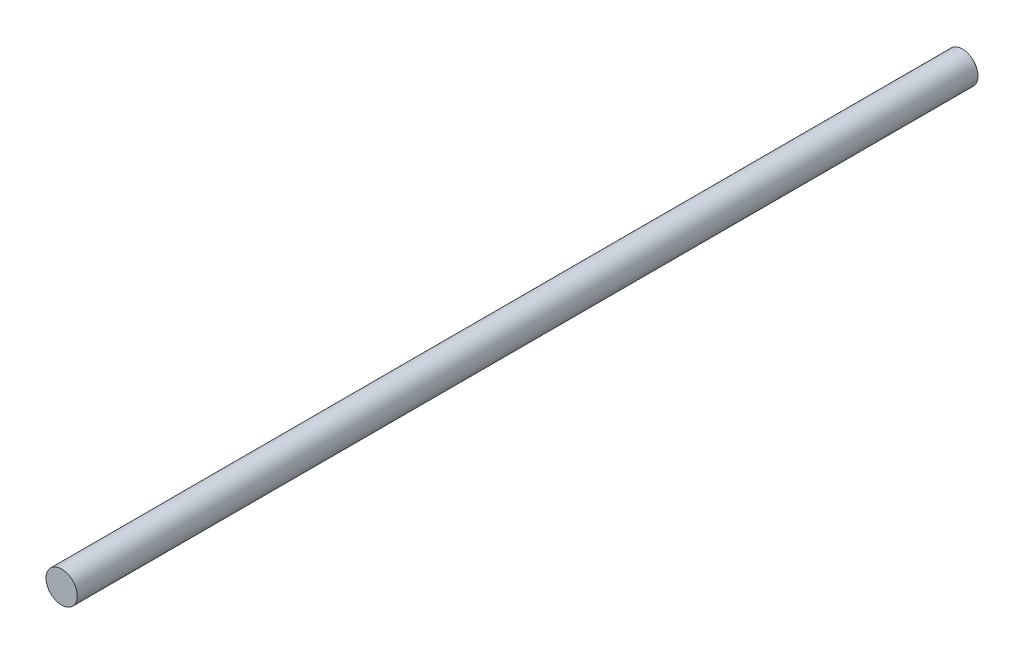
ISO-10303-21;
HEADER;
FILE_DESCRIPTION(('STEP AP214'),'2;1');
FILE_NAME('part.step','',(''),(''),'','','');
FILE_SCHEMA(('AUTOMOTIVE_DESIGN { 1 0 10303 214 1 1 1 1 }'));
ENDSEC;
DATA;
#1=APPLICATION_CONTEXT('core data for automotive mechanical design processes');
#2=APPLICATION_PROTOCOL_DEFINITION('international standard','automotive_design',2000,#1);
#3=PRODUCT_CONTEXT('',#1,'mechanical');
#4=PRODUCT('Part','Part','',(#3));
#5=PRODUCT_RELATED_PRODUCT_CATEGORY('part','',(#4));
#6=PRODUCT_DEFINITION_FORMATION('','',#4);
#7=PRODUCT_DEFINITION_CONTEXT('part definition',#1,'design');
#8=PRODUCT_DEFINITION('design','',#6,#7);
#9=PRODUCT_DEFINITION_SHAPE('','',#8);
#10=(LENGTH_UNIT() NAMED_UNIT(*) SI_UNIT(.MILLI.,.METRE.));
#11=(NAMED_UNIT(*) PLANE_ANGLE_UNIT() SI_UNIT($,.RADIAN.));
#12=(NAMED_UNIT(*) SI_UNIT($,.STERADIAN.) SOLID_ANGLE_UNIT());
#13=UNCERTAINTY_MEASURE_WITH_UNIT(LENGTH_MEASURE(1.E-05),#10,'distance_accuracy_value','');
#14=(GEOMETRIC_REPRESENTATION_CONTEXT(3) GLOBAL_UNCERTAINTY_ASSIGNED_CONTEXT((#13)) GLOBAL_UNIT_ASSIGNED_CONTEXT((#10,
#11,#12)) REPRESENTATION_CONTEXT('',''));
#15=CARTESIAN_POINT('',(0.,0.,0.));
#16=DIRECTION('',(0.,0.,1.));
#17=DIRECTION('',(1.,0.,0.));
#18=AXIS2_PLACEMENT_3D('',#15,#16,#17);
#19=CARTESIAN_POINT('',(0.,0.,720.));
#20=DIRECTION('',(0.,0.,-1.));
#21=DIRECTION('',(-1.,0.,0.));
#22=AXIS2_PLACEMENT_3D('',#19,#20,#21);
#23=CYLINDRICAL_SURFACE('',#22,12.5);
#24=CARTESIAN_POINT('',(0.,0.,720.));
#25=DIRECTION('',(0.,0.,1.));
#26=DIRECTION('',(1.,0.,0.));
#27=AXIS2_PLACEMENT_3D('',#24,#25,#26);
#28=CIRCLE('',#27,12.5);
#29=CARTESIAN_POINT('',(-12.5,0.,720.));
#30=VERTEX_POINT('',#29);
#31=EDGE_CURVE('E10',#30,#30,#28,.T.);
#32=CARTESIAN_POINT('',(0.,0.,0.));
#33=DIRECTION('',(0.,0.,1.));
#34=DIRECTION('',(1.,0.,0.));
#35=AXIS2_PLACEMENT_3D('',#32,#33,#34);
#36=CIRCLE('',#35,12.5);
#37=CARTESIAN_POINT('',(-12.5,0.,-1.11022302462516E-13));
#38=VERTEX_POINT('',#37);
#39=EDGE_CURVE('E34',#38,#38,#36,.T.);
#40=CARTESIAN_POINT('',(-12.5,0.,720.));
#41=CARTESIAN_POINT('',(-12.5,0.,712.5));
#42=CARTESIAN_POINT('',(-12.5,0.,705.));
#43=CARTESIAN_POINT('',(-12.5,0.,690.));
#44=CARTESIAN_POINT('',(-12.5,0.,682.5));
#45=CARTESIAN_POINT('',(-12.5,0.,667.5));
#46=CARTESIAN_POINT('',(-12.5,0.,660.));
#47=CARTESIAN_POINT('',(-12.5,0.,645.));
#48=CARTESIAN_POINT('',(-12.5,0.,637.5));
#49=CARTESIAN_POINT('',(-12.5,0.,622.5));
#50=CARTESIAN_POINT('',(-12.5,0.,615.));
#51=CARTESIAN_POINT('',(-12.5,0.,600.));
#52=CARTESIAN_POINT('',(-12.5,0.,592.5));
#53=CARTESIAN_POINT('',(-12.5,0.,577.5));
#54=CARTESIAN_POINT('',(-12.5,0.,570.));
#55=CARTESIAN_POINT('',(-12.5,0.,555.));
#56=CARTESIAN_POINT('',(-12.5,0.,547.5));
#57=CARTESIAN_POINT('',(-12.5,0.,532.5));
#58=CARTESIAN_POINT('',(-12.5,0.,525.));
#59=CARTESIAN_POINT('',(-12.5,0.,510.));
#60=CARTESIAN_POINT('',(-12.5,0.,502.5));
#61=CARTESIAN_POINT('',(-12.5,0.,487.5));
#62=CARTESIAN_POINT('',(-12.5,0.,480.));
#63=CARTESIAN_POINT('',(-12.5,0.,465.));
#64=CARTESIAN_POINT('',(-12.5,0.,457.5));
#65=CARTESIAN_POINT('',(-12.5,0.,442.5));
#66=CARTESIAN_POINT('',(-12.5,0.,435.));
#67=CARTESIAN_POINT('',(-12.5,0.,420.));
#68=CARTESIAN_POINT('',(-12.5,0.,412.5));
#69=CARTESIAN_POINT('',(-12.5,0.,397.5));
#70=CARTESIAN_POINT('',(-12.5,0.,390.));
#71=CARTESIAN_POINT('',(-12.5,0.,375.));
#72=CARTESIAN_POINT('',(-12.5,0.,367.5));
#73=CARTESIAN_POINT('',(-12.5,0.,352.5));
#74=CARTESIAN_POINT('',(-12.5,0.,345.));
#75=CARTESIAN_POINT('',(-12.5,0.,330.));
#76=CARTESIAN_POINT('',(-12.5,0.,322.5));
#77=CARTESIAN_POINT('',(-12.5,0.,307.5));
#78=CARTESIAN_POINT('',(-12.5,0.,300.));
#79=CARTESIAN_POINT('',(-12.5,0.,285.));
#80=CARTESIAN_POINT('',(-12.5,0.,277.5));
#81=CARTESIAN_POINT('',(-12.5,0.,262.5));
#82=CARTESIAN_POINT('',(-12.5,0.,255.));
#83=CARTESIAN_POINT('',(-12.5,0.,240.));
#84=CARTESIAN_POINT('',(-12.5,0.,232.5));
#85=CARTESIAN_POINT('',(-12.5,0.,217.5));
#86=CARTESIAN_POINT('',(-12.5,0.,210.));
#87=CARTESIAN_POINT('',(-12.5,0.,195.));
#88=CARTESIAN_POINT('',(-12.5,0.,187.5));
#89=CARTESIAN_POINT('',(-12.5,0.,172.5));
#90=CARTESIAN_POINT('',(-12.5,0.,165.));
#91=CARTESIAN_POINT('',(-12.5,0.,150.));
#92=CARTESIAN_POINT('',(-12.5,0.,142.5));
#93=CARTESIAN_POINT('',(-12.5,0.,127.5));
#94=CARTESIAN_POINT('',(-12.5,0.,120.));
#95=CARTESIAN_POINT('',(-12.5,0.,105.));
#96=CARTESIAN_POINT('',(-12.5,0.,97.4999999999999));
#97=CARTESIAN_POINT('',(-12.5,0.,82.4999999999999));
#98=CARTESIAN_POINT('',(-12.5,0.,74.9999999999999));
#99=CARTESIAN_POINT('',(-12.5,0.,59.9999999999999));
#100=CARTESIAN_POINT('',(-12.5,0.,52.4999999999999));
#101=CARTESIAN_POINT('',(-12.5,0.,37.4999999999999));
#102=CARTESIAN_POINT('',(-12.5,0.,29.9999999999999));
#103=CARTESIAN_POINT('',(-12.5,0.,14.9999999999999));
#104=CARTESIAN_POINT('',(-12.5,0.,7.49999999999989));
#105=CARTESIAN_POINT('',(-12.5,0.,-1.11022302462516E-13));
#106=B_SPLINE_CURVE_WITH_KNOTS('',3,(#40,#41,#42,#43,#44,#45,#46,#47,#48,#49,#50,#51,#52,#53,
#54,#55,#56,#57,#58,#59,#60,#61,#62,#63,#64,#65,#66,#67,#68,#69,#70,#71,#72,#73,#74,#75,#76,#77,
#78,#79,#80,#81,#82,#83,#84,#85,#86,#87,#88,#89,#90,#91,#92,#93,#94,#95,#96,#97,#98,#99,#100,
#101,#102,#103,#104,#105),.UNSPECIFIED.,.F.,.F.,(4,2,2,2,2,2,2,2,2,2,2,2,2,2,2,2,2,2,2,2,2,2,2,
2,2,2,2,2,2,2,2,2,4),(0.,22.5,44.9999999999999,67.4999999999999,90.,112.5,135.,157.5,180.,202.5,
225.,247.5,270.,292.5,315.,337.5,360.,382.5,405.,427.5,450.,472.5,495.,517.5,540.,562.5,585.,
607.5,630.,652.5,675.,697.5,720.),.UNSPECIFIED.);
#107=EDGE_CURVE('BSEAM31',#30,#38,#106,.T.);
#108=ORIENTED_EDGE('',*,*,#31,.F.);
#109=ORIENTED_EDGE('',*,*,#39,.T.);
#110=ORIENTED_EDGE('',*,*,#107,.T.);
#111=ORIENTED_EDGE('',*,*,#107,.F.);
#112=EDGE_LOOP('',(#108,#110,#109,#111));
#113=FACE_BOUND('',#112,.T.);
#114=ADVANCED_FACE('F31',(#113),#23,.T.);
#115=CARTESIAN_POINT('',(0.,0.,720.));
#116=DIRECTION('',(0.,0.,1.));
#117=DIRECTION('',(1.,0.,0.));
#118=AXIS2_PLACEMENT_3D('',#115,#116,#117);
#119=PLANE('',#118);
#120=ORIENTED_EDGE('',*,*,#31,.T.);
#121=EDGE_LOOP('',(#120));
#122=FACE_BOUND('',#121,.T.);
#123=ADVANCED_FACE('F46',(#122),#119,.T.);
#124=CARTESIAN_POINT('',(0.,0.,0.));
#125=DIRECTION('',(0.,0.,1.));
#126=DIRECTION('',(1.,0.,0.));
#127=AXIS2_PLACEMENT_3D('',#124,#125,#126);
#128=PLANE('',#127);
#129=ORIENTED_EDGE('',*,*,#39,.F.);
#130=EDGE_LOOP('',(#129));
#131=FACE_BOUND('',#130,.T.);
#132=ADVANCED_FACE('F44',(#131),#128,.F.);
#133=CLOSED_SHELL('',(#114,#123,#132));
#134=MANIFOLD_SOLID_BREP('B2',#133);
#135=ADVANCED_BREP_SHAPE_REPRESENTATION('',(#18,#134),#14);
#136=SHAPE_DEFINITION_REPRESENTATION(#9,#135);
ENDSEC;
END-ISO-10303-21;
